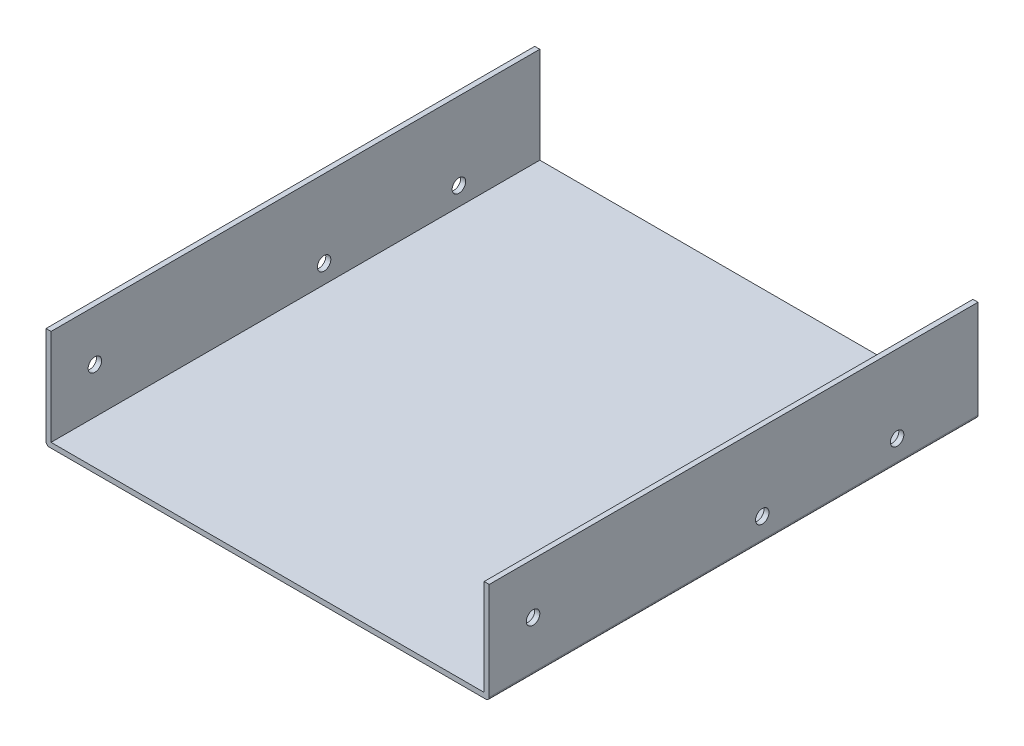
ISO-10303-21;
HEADER;
FILE_DESCRIPTION(('STEP AP214'),'2;1');
FILE_NAME('part.step','',(''),(''),'','','');
FILE_SCHEMA(('AUTOMOTIVE_DESIGN { 1 0 10303 214 1 1 1 1 }'));
ENDSEC;
DATA;
#1=APPLICATION_CONTEXT('core data for automotive mechanical design processes');
#2=APPLICATION_PROTOCOL_DEFINITION('international standard','automotive_design',2000,#1);
#3=PRODUCT_CONTEXT('',#1,'mechanical');
#4=PRODUCT('Part','Part','',(#3));
#5=PRODUCT_RELATED_PRODUCT_CATEGORY('part','',(#4));
#6=PRODUCT_DEFINITION_FORMATION('','',#4);
#7=PRODUCT_DEFINITION_CONTEXT('part definition',#1,'design');
#8=PRODUCT_DEFINITION('design','',#6,#7);
#9=PRODUCT_DEFINITION_SHAPE('','',#8);
#10=(LENGTH_UNIT() NAMED_UNIT(*) SI_UNIT(.MILLI.,.METRE.));
#11=(NAMED_UNIT(*) PLANE_ANGLE_UNIT() SI_UNIT($,.RADIAN.));
#12=(NAMED_UNIT(*) SI_UNIT($,.STERADIAN.) SOLID_ANGLE_UNIT());
#13=UNCERTAINTY_MEASURE_WITH_UNIT(LENGTH_MEASURE(1.E-05),#10,'distance_accuracy_value','');
#14=(GEOMETRIC_REPRESENTATION_CONTEXT(3) GLOBAL_UNCERTAINTY_ASSIGNED_CONTEXT((#13)) GLOBAL_UNIT_ASSIGNED_CONTEXT((#10,
#11,#12)) REPRESENTATION_CONTEXT('',''));
#15=CARTESIAN_POINT('',(0.,0.,0.));
#16=DIRECTION('',(0.,0.,1.));
#17=DIRECTION('',(1.,0.,0.));
#18=AXIS2_PLACEMENT_3D('',#15,#16,#17);
#19=CARTESIAN_POINT('',(-65.75,14.5,72.5));
#20=DIRECTION('',(1.,0.,0.));
#21=DIRECTION('',(0.,1.,0.));
#22=AXIS2_PLACEMENT_3D('',#19,#20,#21);
#23=PLANE('',#22);
#24=CARTESIAN_POINT('',(-65.75,-8.49999999999997,-48.5));
#25=DIRECTION('',(1.,0.,0.));
#26=DIRECTION('',(0.,1.,0.));
#27=AXIS2_PLACEMENT_3D('',#24,#25,#26);
#28=CIRCLE('',#27,2.);
#29=CARTESIAN_POINT('',(-65.75,-6.49999999999997,-48.5));
#30=VERTEX_POINT('',#29);
#31=EDGE_CURVE('E194',#30,#30,#28,.T.);
#32=ORIENTED_EDGE('',*,*,#31,.T.);
#33=EDGE_LOOP('',(#32));
#34=FACE_BOUND('',#33,.T.);
#35=CARTESIAN_POINT('',(-65.75,-8.49999999999997,-8.49999999999999));
#36=DIRECTION('',(1.,0.,0.));
#37=DIRECTION('',(0.,1.,0.));
#38=AXIS2_PLACEMENT_3D('',#35,#36,#37);
#39=CIRCLE('',#38,2.);
#40=CARTESIAN_POINT('',(-65.75,-6.49999999999997,-8.49999999999999));
#41=VERTEX_POINT('',#40);
#42=EDGE_CURVE('E191',#41,#41,#39,.T.);
#43=ORIENTED_EDGE('',*,*,#42,.T.);
#44=EDGE_LOOP('',(#43));
#45=FACE_BOUND('',#44,.T.);
#46=CARTESIAN_POINT('',(-65.75,-0.499999999999969,59.5));
#47=DIRECTION('',(1.,0.,0.));
#48=DIRECTION('',(0.,1.,0.));
#49=AXIS2_PLACEMENT_3D('',#46,#47,#48);
#50=CIRCLE('',#49,2.);
#51=CARTESIAN_POINT('',(-65.75,1.50000000000003,59.5));
#52=VERTEX_POINT('',#51);
#53=EDGE_CURVE('E147',#52,#52,#50,.T.);
#54=ORIENTED_EDGE('',*,*,#53,.T.);
#55=EDGE_LOOP('',(#54));
#56=FACE_BOUND('',#55,.T.);
#57=DIRECTION('',(0.,-1.,0.));
#58=VECTOR('',#57,1.);
#59=CARTESIAN_POINT('',(-65.75,14.5,-72.5));
#60=LINE('',#59,#58);
#61=CARTESIAN_POINT('',(-65.75,14.5,-72.5));
#62=VERTEX_POINT('',#61);
#63=CARTESIAN_POINT('',(-65.75,-14.5,-72.5));
#64=VERTEX_POINT('',#63);
#65=EDGE_CURVE('E143',#62,#64,#60,.T.);
#66=ORIENTED_EDGE('',*,*,#65,.T.);
#67=DIRECTION('',(0.,0.,-1.));
#68=VECTOR('',#67,1.);
#69=CARTESIAN_POINT('',(-65.75,-14.5,72.5));
#70=LINE('',#69,#68);
#71=CARTESIAN_POINT('',(-65.75,-14.5,72.5));
#72=VERTEX_POINT('',#71);
#73=EDGE_CURVE('E11',#72,#64,#70,.T.);
#74=ORIENTED_EDGE('',*,*,#73,.F.);
#75=DIRECTION('',(0.,-1.,0.));
#76=VECTOR('',#75,1.);
#77=CARTESIAN_POINT('',(-65.75,14.5,72.5));
#78=LINE('',#77,#76);
#79=CARTESIAN_POINT('',(-65.75,14.5,72.5));
#80=VERTEX_POINT('',#79);
#81=EDGE_CURVE('E162',#80,#72,#78,.T.);
#82=ORIENTED_EDGE('',*,*,#81,.F.);
#83=DIRECTION('',(0.,0.,-1.));
#84=VECTOR('',#83,1.);
#85=CARTESIAN_POINT('',(-65.75,14.5,72.5));
#86=LINE('',#85,#84);
#87=EDGE_CURVE('E139',#80,#62,#86,.T.);
#88=ORIENTED_EDGE('',*,*,#87,.T.);
#89=EDGE_LOOP('',(#66,#74,#82,#88));
#90=FACE_BOUND('',#89,.T.);
#91=ADVANCED_FACE('F33',(#34,#45,#56,#90),#23,.F.);
#92=CARTESIAN_POINT('',(-64.75,-14.5,72.5));
#93=DIRECTION('',(0.,0.,-1.));
#94=DIRECTION('',(-1.,0.,0.));
#95=AXIS2_PLACEMENT_3D('',#92,#93,#94);
#96=CYLINDRICAL_SURFACE('',#95,1.);
#97=CARTESIAN_POINT('',(-64.75,-14.5,-72.5));
#98=DIRECTION('',(0.,0.,1.));
#99=DIRECTION('',(1.,0.,0.));
#100=AXIS2_PLACEMENT_3D('',#97,#98,#99);
#101=CIRCLE('',#100,1.);
#102=CARTESIAN_POINT('',(-64.75,-15.5,-72.5));
#103=VERTEX_POINT('',#102);
#104=EDGE_CURVE('E146',#64,#103,#101,.T.);
#105=ORIENTED_EDGE('',*,*,#104,.T.);
#106=DIRECTION('',(0.,0.,-1.));
#107=VECTOR('',#106,1.);
#108=CARTESIAN_POINT('',(-64.75,-15.5,72.5));
#109=LINE('',#108,#107);
#110=CARTESIAN_POINT('',(-64.75,-15.5,72.5));
#111=VERTEX_POINT('',#110);
#112=EDGE_CURVE('E42',#111,#103,#109,.T.);
#113=ORIENTED_EDGE('',*,*,#112,.F.);
#114=CARTESIAN_POINT('',(-64.75,-14.5,72.5));
#115=DIRECTION('',(0.,0.,1.));
#116=DIRECTION('',(1.,0.,0.));
#117=AXIS2_PLACEMENT_3D('',#114,#115,#116);
#118=CIRCLE('',#117,1.);
#119=EDGE_CURVE('E100',#72,#111,#118,.T.);
#120=ORIENTED_EDGE('',*,*,#119,.F.);
#121=ORIENTED_EDGE('',*,*,#73,.T.);
#122=EDGE_LOOP('',(#105,#113,#120,#121));
#123=FACE_BOUND('',#122,.T.);
#124=ADVANCED_FACE('F249',(#123),#96,.T.);
#125=CARTESIAN_POINT('',(-64.75,-15.5,72.5));
#126=DIRECTION('',(0.,1.,0.));
#127=DIRECTION('',(-1.,0.,0.));
#128=AXIS2_PLACEMENT_3D('',#125,#126,#127);
#129=PLANE('',#128);
#130=DIRECTION('',(1.,0.,0.));
#131=VECTOR('',#130,1.);
#132=CARTESIAN_POINT('',(-64.75,-15.5,-72.5));
#133=LINE('',#132,#131);
#134=CARTESIAN_POINT('',(64.75,-15.5,-72.5));
#135=VERTEX_POINT('',#134);
#136=EDGE_CURVE('E149',#103,#135,#133,.T.);
#137=ORIENTED_EDGE('',*,*,#136,.T.);
#138=DIRECTION('',(0.,0.,-1.));
#139=VECTOR('',#138,1.);
#140=CARTESIAN_POINT('',(64.75,-15.5,72.5));
#141=LINE('',#140,#139);
#142=CARTESIAN_POINT('',(64.75,-15.5,72.5));
#143=VERTEX_POINT('',#142);
#144=EDGE_CURVE('E175',#143,#135,#141,.T.);
#145=ORIENTED_EDGE('',*,*,#144,.F.);
#146=DIRECTION('',(1.,0.,0.));
#147=VECTOR('',#146,1.);
#148=CARTESIAN_POINT('',(-64.75,-15.5,72.5));
#149=LINE('',#148,#147);
#150=EDGE_CURVE('E213',#111,#143,#149,.T.);
#151=ORIENTED_EDGE('',*,*,#150,.F.);
#152=ORIENTED_EDGE('',*,*,#112,.T.);
#153=EDGE_LOOP('',(#137,#145,#151,#152));
#154=FACE_BOUND('',#153,.T.);
#155=ADVANCED_FACE('F254',(#154),#129,.F.);
#156=CARTESIAN_POINT('',(64.75,-14.5,72.5));
#157=DIRECTION('',(0.,0.,-1.));
#158=DIRECTION('',(-1.,0.,0.));
#159=AXIS2_PLACEMENT_3D('',#156,#157,#158);
#160=CYLINDRICAL_SURFACE('',#159,1.00000000000003);
#161=CARTESIAN_POINT('',(64.75,-14.5,-72.5));
#162=DIRECTION('',(0.,0.,1.));
#163=DIRECTION('',(1.,0.,0.));
#164=AXIS2_PLACEMENT_3D('',#161,#162,#163);
#165=CIRCLE('',#164,1.00000000000003);
#166=CARTESIAN_POINT('',(65.75,-14.5,-72.5));
#167=VERTEX_POINT('',#166);
#168=EDGE_CURVE('E151',#135,#167,#165,.T.);
#169=ORIENTED_EDGE('',*,*,#168,.T.);
#170=DIRECTION('',(0.,0.,-1.));
#171=VECTOR('',#170,1.);
#172=CARTESIAN_POINT('',(65.75,-14.5,72.5));
#173=LINE('',#172,#171);
#174=CARTESIAN_POINT('',(65.75,-14.5,72.5));
#175=VERTEX_POINT('',#174);
#176=EDGE_CURVE('E172',#175,#167,#173,.T.);
#177=ORIENTED_EDGE('',*,*,#176,.F.);
#178=CARTESIAN_POINT('',(64.75,-14.5,72.5));
#179=DIRECTION('',(0.,0.,1.));
#180=DIRECTION('',(1.,0.,0.));
#181=AXIS2_PLACEMENT_3D('',#178,#179,#180);
#182=CIRCLE('',#181,1.00000000000003);
#183=EDGE_CURVE('E215',#143,#175,#182,.T.);
#184=ORIENTED_EDGE('',*,*,#183,.F.);
#185=ORIENTED_EDGE('',*,*,#144,.T.);
#186=EDGE_LOOP('',(#169,#177,#184,#185));
#187=FACE_BOUND('',#186,.T.);
#188=ADVANCED_FACE('F300',(#187),#160,.T.);
#189=CARTESIAN_POINT('',(65.75,14.5,72.5));
#190=DIRECTION('',(-1.,0.,0.));
#191=DIRECTION('',(0.,-1.,0.));
#192=AXIS2_PLACEMENT_3D('',#189,#190,#191);
#193=PLANE('',#192);
#194=CARTESIAN_POINT('',(65.75,-8.49999999999997,-48.5));
#195=DIRECTION('',(1.,0.,0.));
#196=DIRECTION('',(0.,0.,-1.));
#197=AXIS2_PLACEMENT_3D('',#194,#195,#196);
#198=CIRCLE('',#197,2.);
#199=CARTESIAN_POINT('',(65.75,-8.49999999999997,-50.5));
#200=VERTEX_POINT('',#199);
#201=EDGE_CURVE('E290',#200,#200,#198,.T.);
#202=ORIENTED_EDGE('',*,*,#201,.F.);
#203=EDGE_LOOP('',(#202));
#204=FACE_BOUND('',#203,.T.);
#205=CARTESIAN_POINT('',(65.75,-8.49999999999997,-8.49999999999999));
#206=DIRECTION('',(1.,0.,0.));
#207=DIRECTION('',(0.,0.,-1.));
#208=AXIS2_PLACEMENT_3D('',#205,#206,#207);
#209=CIRCLE('',#208,2.);
#210=CARTESIAN_POINT('',(65.75,-8.49999999999997,-10.5));
#211=VERTEX_POINT('',#210);
#212=EDGE_CURVE('E187',#211,#211,#209,.T.);
#213=ORIENTED_EDGE('',*,*,#212,.F.);
#214=EDGE_LOOP('',(#213));
#215=FACE_BOUND('',#214,.T.);
#216=CARTESIAN_POINT('',(65.75,-0.499999999999969,59.5));
#217=DIRECTION('',(1.,0.,0.));
#218=DIRECTION('',(0.,0.,-1.));
#219=AXIS2_PLACEMENT_3D('',#216,#217,#218);
#220=CIRCLE('',#219,2.);
#221=CARTESIAN_POINT('',(65.75,-0.499999999999969,57.5));
#222=VERTEX_POINT('',#221);
#223=EDGE_CURVE('E183',#222,#222,#220,.T.);
#224=ORIENTED_EDGE('',*,*,#223,.F.);
#225=EDGE_LOOP('',(#224));
#226=FACE_BOUND('',#225,.T.);
#227=DIRECTION('',(0.,1.,0.));
#228=VECTOR('',#227,1.);
#229=CARTESIAN_POINT('',(65.75,14.5,-72.5));
#230=LINE('',#229,#228);
#231=CARTESIAN_POINT('',(65.75,14.5,-72.5));
#232=VERTEX_POINT('',#231);
#233=EDGE_CURVE('E153',#167,#232,#230,.T.);
#234=ORIENTED_EDGE('',*,*,#233,.T.);
#235=DIRECTION('',(0.,0.,-1.));
#236=VECTOR('',#235,1.);
#237=CARTESIAN_POINT('',(65.75,14.5,72.5));
#238=LINE('',#237,#236);
#239=CARTESIAN_POINT('',(65.75,14.5,72.5));
#240=VERTEX_POINT('',#239);
#241=EDGE_CURVE('E169',#240,#232,#238,.T.);
#242=ORIENTED_EDGE('',*,*,#241,.F.);
#243=DIRECTION('',(0.,1.,0.));
#244=VECTOR('',#243,1.);
#245=CARTESIAN_POINT('',(65.75,14.5,72.5));
#246=LINE('',#245,#244);
#247=EDGE_CURVE('E217',#175,#240,#246,.T.);
#248=ORIENTED_EDGE('',*,*,#247,.F.);
#249=ORIENTED_EDGE('',*,*,#176,.T.);
#250=EDGE_LOOP('',(#234,#242,#248,#249));
#251=FACE_BOUND('',#250,.T.);
#252=ADVANCED_FACE('F297',(#204,#215,#226,#251),#193,.F.);
#253=CARTESIAN_POINT('',(64.25,14.5,72.5));
#254=DIRECTION('',(0.,-1.,0.));
#255=DIRECTION('',(0.,0.,-1.));
#256=AXIS2_PLACEMENT_3D('',#253,#254,#255);
#257=PLANE('',#256);
#258=DIRECTION('',(-1.,0.,0.));
#259=VECTOR('',#258,1.);
#260=CARTESIAN_POINT('',(64.25,14.5,-72.5));
#261=LINE('',#260,#259);
#262=CARTESIAN_POINT('',(64.25,14.5,-72.5));
#263=VERTEX_POINT('',#262);
#264=EDGE_CURVE('E155',#232,#263,#261,.T.);
#265=ORIENTED_EDGE('',*,*,#264,.T.);
#266=DIRECTION('',(0.,0.,-1.));
#267=VECTOR('',#266,1.);
#268=CARTESIAN_POINT('',(64.25,14.5,72.5));
#269=LINE('',#268,#267);
#270=CARTESIAN_POINT('',(64.25,14.5,72.5));
#271=VERTEX_POINT('',#270);
#272=EDGE_CURVE('E166',#271,#263,#269,.T.);
#273=ORIENTED_EDGE('',*,*,#272,.F.);
#274=DIRECTION('',(-1.,0.,0.));
#275=VECTOR('',#274,1.);
#276=CARTESIAN_POINT('',(64.25,14.5,72.5));
#277=LINE('',#276,#275);
#278=EDGE_CURVE('E219',#240,#271,#277,.T.);
#279=ORIENTED_EDGE('',*,*,#278,.F.);
#280=ORIENTED_EDGE('',*,*,#241,.T.);
#281=EDGE_LOOP('',(#265,#273,#279,#280));
#282=FACE_BOUND('',#281,.T.);
#283=ADVANCED_FACE('F225',(#282),#257,.F.);
#284=CARTESIAN_POINT('',(64.25,-14.,72.5));
#285=DIRECTION('',(1.,0.,0.));
#286=DIRECTION('',(0.,1.,0.));
#287=AXIS2_PLACEMENT_3D('',#284,#285,#286);
#288=PLANE('',#287);
#289=CARTESIAN_POINT('',(64.25,-8.49999999999997,-48.5));
#290=DIRECTION('',(1.,0.,0.));
#291=DIRECTION('',(0.,1.,0.));
#292=AXIS2_PLACEMENT_3D('',#289,#290,#291);
#293=CIRCLE('',#292,2.);
#294=CARTESIAN_POINT('',(64.25,-6.49999999999997,-48.5));
#295=VERTEX_POINT('',#294);
#296=EDGE_CURVE('E199',#295,#295,#293,.T.);
#297=ORIENTED_EDGE('',*,*,#296,.T.);
#298=EDGE_LOOP('',(#297));
#299=FACE_BOUND('',#298,.T.);
#300=CARTESIAN_POINT('',(64.25,-8.49999999999997,-8.49999999999999));
#301=DIRECTION('',(1.,0.,0.));
#302=DIRECTION('',(0.,1.,0.));
#303=AXIS2_PLACEMENT_3D('',#300,#301,#302);
#304=CIRCLE('',#303,2.);
#305=CARTESIAN_POINT('',(64.25,-6.49999999999997,-8.49999999999999));
#306=VERTEX_POINT('',#305);
#307=EDGE_CURVE('E186',#306,#306,#304,.T.);
#308=ORIENTED_EDGE('',*,*,#307,.T.);
#309=EDGE_LOOP('',(#308));
#310=FACE_BOUND('',#309,.T.);
#311=CARTESIAN_POINT('',(64.25,-0.499999999999969,59.5));
#312=DIRECTION('',(1.,0.,0.));
#313=DIRECTION('',(0.,1.,0.));
#314=AXIS2_PLACEMENT_3D('',#311,#312,#313);
#315=CIRCLE('',#314,2.);
#316=CARTESIAN_POINT('',(64.25,1.50000000000003,59.5));
#317=VERTEX_POINT('',#316);
#318=EDGE_CURVE('E182',#317,#317,#315,.T.);
#319=ORIENTED_EDGE('',*,*,#318,.T.);
#320=EDGE_LOOP('',(#319));
#321=FACE_BOUND('',#320,.T.);
#322=DIRECTION('',(0.,-1.,0.));
#323=VECTOR('',#322,1.);
#324=CARTESIAN_POINT('',(64.25,-14.,-72.5));
#325=LINE('',#324,#323);
#326=CARTESIAN_POINT('',(64.25,-14.,-72.5));
#327=VERTEX_POINT('',#326);
#328=EDGE_CURVE('E157',#263,#327,#325,.T.);
#329=ORIENTED_EDGE('',*,*,#328,.T.);
#330=DIRECTION('',(0.,0.,-1.));
#331=VECTOR('',#330,1.);
#332=CARTESIAN_POINT('',(64.25,-14.,72.5));
#333=LINE('',#332,#331);
#334=CARTESIAN_POINT('',(64.25,-14.,72.5));
#335=VERTEX_POINT('',#334);
#336=EDGE_CURVE('E134',#335,#327,#333,.T.);
#337=ORIENTED_EDGE('',*,*,#336,.F.);
#338=DIRECTION('',(0.,-1.,0.));
#339=VECTOR('',#338,1.);
#340=CARTESIAN_POINT('',(64.25,-14.,72.5));
#341=LINE('',#340,#339);
#342=EDGE_CURVE('E125',#271,#335,#341,.T.);
#343=ORIENTED_EDGE('',*,*,#342,.F.);
#344=ORIENTED_EDGE('',*,*,#272,.T.);
#345=EDGE_LOOP('',(#329,#337,#343,#344));
#346=FACE_BOUND('',#345,.T.);
#347=ADVANCED_FACE('F229',(#299,#310,#321,#346),#288,.F.);
#348=CARTESIAN_POINT('',(-64.25,-14.,72.5));
#349=DIRECTION('',(0.,-1.,0.));
#350=DIRECTION('',(1.,0.,0.));
#351=AXIS2_PLACEMENT_3D('',#348,#349,#350);
#352=PLANE('',#351);
#353=DIRECTION('',(-1.,0.,0.));
#354=VECTOR('',#353,1.);
#355=CARTESIAN_POINT('',(-64.25,-14.,-72.5));
#356=LINE('',#355,#354);
#357=CARTESIAN_POINT('',(-64.25,-14.,-72.5));
#358=VERTEX_POINT('',#357);
#359=EDGE_CURVE('E133',#327,#358,#356,.T.);
#360=ORIENTED_EDGE('',*,*,#359,.T.);
#361=DIRECTION('',(0.,0.,-1.));
#362=VECTOR('',#361,1.);
#363=CARTESIAN_POINT('',(-64.25,-14.,72.5));
#364=LINE('',#363,#362);
#365=CARTESIAN_POINT('',(-64.25,-14.,72.5));
#366=VERTEX_POINT('',#365);
#367=EDGE_CURVE('E130',#366,#358,#364,.T.);
#368=ORIENTED_EDGE('',*,*,#367,.F.);
#369=DIRECTION('',(-1.,0.,0.));
#370=VECTOR('',#369,1.);
#371=CARTESIAN_POINT('',(-64.25,-14.,72.5));
#372=LINE('',#371,#370);
#373=EDGE_CURVE('E119',#335,#366,#372,.T.);
#374=ORIENTED_EDGE('',*,*,#373,.F.);
#375=ORIENTED_EDGE('',*,*,#336,.T.);
#376=EDGE_LOOP('',(#360,#368,#374,#375));
#377=FACE_BOUND('',#376,.T.);
#378=ADVANCED_FACE('F131',(#377),#352,.F.);
#379=CARTESIAN_POINT('',(-64.25,14.5,72.5));
#380=DIRECTION('',(-1.,0.,0.));
#381=DIRECTION('',(0.,0.,1.));
#382=AXIS2_PLACEMENT_3D('',#379,#380,#381);
#383=PLANE('',#382);
#384=CARTESIAN_POINT('',(-64.25,-8.49999999999997,-48.5));
#385=DIRECTION('',(-1.,0.,0.));
#386=DIRECTION('',(0.,0.,1.));
#387=AXIS2_PLACEMENT_3D('',#384,#385,#386);
#388=CIRCLE('',#387,2.);
#389=CARTESIAN_POINT('',(-64.25,-8.49999999999997,-46.5));
#390=VERTEX_POINT('',#389);
#391=EDGE_CURVE('E36',#390,#390,#388,.T.);
#392=ORIENTED_EDGE('',*,*,#391,.T.);
#393=EDGE_LOOP('',(#392));
#394=FACE_BOUND('',#393,.T.);
#395=CARTESIAN_POINT('',(-64.25,-8.49999999999997,-8.49999999999999));
#396=DIRECTION('',(-1.,0.,0.));
#397=DIRECTION('',(0.,0.,1.));
#398=AXIS2_PLACEMENT_3D('',#395,#396,#397);
#399=CIRCLE('',#398,2.);
#400=CARTESIAN_POINT('',(-64.25,-8.49999999999997,-6.49999999999999));
#401=VERTEX_POINT('',#400);
#402=EDGE_CURVE('E184',#401,#401,#399,.T.);
#403=ORIENTED_EDGE('',*,*,#402,.T.);
#404=EDGE_LOOP('',(#403));
#405=FACE_BOUND('',#404,.T.);
#406=CARTESIAN_POINT('',(-64.25,-0.499999999999969,59.5));
#407=DIRECTION('',(-1.,0.,0.));
#408=DIRECTION('',(0.,0.,1.));
#409=AXIS2_PLACEMENT_3D('',#406,#407,#408);
#410=CIRCLE('',#409,2.);
#411=CARTESIAN_POINT('',(-64.25,-0.499999999999969,61.5));
#412=VERTEX_POINT('',#411);
#413=EDGE_CURVE('E180',#412,#412,#410,.T.);
#414=ORIENTED_EDGE('',*,*,#413,.T.);
#415=EDGE_LOOP('',(#414));
#416=FACE_BOUND('',#415,.T.);
#417=DIRECTION('',(0.,1.,0.));
#418=VECTOR('',#417,1.);
#419=CARTESIAN_POINT('',(-64.25,14.5,-72.5));
#420=LINE('',#419,#418);
#421=CARTESIAN_POINT('',(-64.25,14.5,-72.5));
#422=VERTEX_POINT('',#421);
#423=EDGE_CURVE('E86',#358,#422,#420,.T.);
#424=ORIENTED_EDGE('',*,*,#423,.T.);
#425=DIRECTION('',(0.,0.,-1.));
#426=VECTOR('',#425,1.);
#427=CARTESIAN_POINT('',(-64.25,14.5,72.5));
#428=LINE('',#427,#426);
#429=CARTESIAN_POINT('',(-64.25,14.5,72.5));
#430=VERTEX_POINT('',#429);
#431=EDGE_CURVE('E135',#430,#422,#428,.T.);
#432=ORIENTED_EDGE('',*,*,#431,.F.);
#433=DIRECTION('',(0.,1.,0.));
#434=VECTOR('',#433,1.);
#435=CARTESIAN_POINT('',(-64.25,14.5,72.5));
#436=LINE('',#435,#434);
#437=EDGE_CURVE('E123',#366,#430,#436,.T.);
#438=ORIENTED_EDGE('',*,*,#437,.F.);
#439=ORIENTED_EDGE('',*,*,#367,.T.);
#440=EDGE_LOOP('',(#424,#432,#438,#439));
#441=FACE_BOUND('',#440,.T.);
#442=ADVANCED_FACE('F137',(#394,#405,#416,#441),#383,.F.);
#443=CARTESIAN_POINT('',(-65.75,14.5,72.5));
#444=DIRECTION('',(0.,-1.,0.));
#445=DIRECTION('',(0.,0.,-1.));
#446=AXIS2_PLACEMENT_3D('',#443,#444,#445);
#447=PLANE('',#446);
#448=DIRECTION('',(-1.,0.,0.));
#449=VECTOR('',#448,1.);
#450=CARTESIAN_POINT('',(-65.75,14.5,-72.5));
#451=LINE('',#450,#449);
#452=EDGE_CURVE('E92',#422,#62,#451,.T.);
#453=ORIENTED_EDGE('',*,*,#452,.T.);
#454=ORIENTED_EDGE('',*,*,#87,.F.);
#455=DIRECTION('',(-1.,0.,0.));
#456=VECTOR('',#455,1.);
#457=CARTESIAN_POINT('',(-65.75,14.5,72.5));
#458=LINE('',#457,#456);
#459=EDGE_CURVE('E51',#430,#80,#458,.T.);
#460=ORIENTED_EDGE('',*,*,#459,.F.);
#461=ORIENTED_EDGE('',*,*,#431,.T.);
#462=EDGE_LOOP('',(#453,#454,#460,#461));
#463=FACE_BOUND('',#462,.T.);
#464=ADVANCED_FACE('F237',(#463),#447,.F.);
#465=CARTESIAN_POINT('',(-64.75,-14.5,72.5));
#466=DIRECTION('',(0.,0.,1.));
#467=DIRECTION('',(1.,0.,0.));
#468=AXIS2_PLACEMENT_3D('',#465,#466,#467);
#469=PLANE('',#468);
#470=ORIENTED_EDGE('',*,*,#81,.T.);
#471=ORIENTED_EDGE('',*,*,#119,.T.);
#472=ORIENTED_EDGE('',*,*,#150,.T.);
#473=ORIENTED_EDGE('',*,*,#183,.T.);
#474=ORIENTED_EDGE('',*,*,#247,.T.);
#475=ORIENTED_EDGE('',*,*,#278,.T.);
#476=ORIENTED_EDGE('',*,*,#342,.T.);
#477=ORIENTED_EDGE('',*,*,#373,.T.);
#478=ORIENTED_EDGE('',*,*,#437,.T.);
#479=ORIENTED_EDGE('',*,*,#459,.T.);
#480=EDGE_LOOP('',(#470,#471,#472,#473,#474,#475,#476,#477,#478,#479));
#481=FACE_BOUND('',#480,.T.);
#482=ADVANCED_FACE('F121',(#481),#469,.T.);
#483=CARTESIAN_POINT('',(-64.75,-14.5,-72.5));
#484=DIRECTION('',(0.,0.,1.));
#485=DIRECTION('',(1.,0.,0.));
#486=AXIS2_PLACEMENT_3D('',#483,#484,#485);
#487=PLANE('',#486);
#488=ORIENTED_EDGE('',*,*,#65,.F.);
#489=ORIENTED_EDGE('',*,*,#452,.F.);
#490=ORIENTED_EDGE('',*,*,#423,.F.);
#491=ORIENTED_EDGE('',*,*,#359,.F.);
#492=ORIENTED_EDGE('',*,*,#328,.F.);
#493=ORIENTED_EDGE('',*,*,#264,.F.);
#494=ORIENTED_EDGE('',*,*,#233,.F.);
#495=ORIENTED_EDGE('',*,*,#168,.F.);
#496=ORIENTED_EDGE('',*,*,#136,.F.);
#497=ORIENTED_EDGE('',*,*,#104,.F.);
#498=EDGE_LOOP('',(#488,#489,#490,#491,#492,#493,#494,#495,#496,#497));
#499=FACE_BOUND('',#498,.T.);
#500=ADVANCED_FACE('F232',(#499),#487,.F.);
#501=CARTESIAN_POINT('',(-79.25,-0.499999999999969,59.5));
#502=DIRECTION('',(1.,0.,0.));
#503=DIRECTION('',(0.,0.,-1.));
#504=AXIS2_PLACEMENT_3D('',#501,#502,#503);
#505=CYLINDRICAL_SURFACE('',#504,2.);
#506=ORIENTED_EDGE('',*,*,#413,.F.);
#507=EDGE_LOOP('',(#506));
#508=FACE_BOUND('',#507,.T.);
#509=ORIENTED_EDGE('',*,*,#53,.F.);
#510=EDGE_LOOP('',(#509));
#511=FACE_BOUND('',#510,.T.);
#512=ADVANCED_FACE('F261',(#508,#511),#505,.F.);
#513=ORIENTED_EDGE('',*,*,#223,.T.);
#514=EDGE_LOOP('',(#513));
#515=FACE_BOUND('',#514,.T.);
#516=ORIENTED_EDGE('',*,*,#318,.F.);
#517=EDGE_LOOP('',(#516));
#518=FACE_BOUND('',#517,.T.);
#519=ADVANCED_FACE('F263',(#515,#518),#505,.F.);
#520=CARTESIAN_POINT('',(-79.25,-8.49999999999997,-8.49999999999999));
#521=DIRECTION('',(1.,0.,0.));
#522=DIRECTION('',(0.,0.,-1.));
#523=AXIS2_PLACEMENT_3D('',#520,#521,#522);
#524=CYLINDRICAL_SURFACE('',#523,2.);
#525=ORIENTED_EDGE('',*,*,#402,.F.);
#526=EDGE_LOOP('',(#525));
#527=FACE_BOUND('',#526,.T.);
#528=ORIENTED_EDGE('',*,*,#42,.F.);
#529=EDGE_LOOP('',(#528));
#530=FACE_BOUND('',#529,.T.);
#531=ADVANCED_FACE('F270',(#527,#530),#524,.F.);
#532=ORIENTED_EDGE('',*,*,#212,.T.);
#533=EDGE_LOOP('',(#532));
#534=FACE_BOUND('',#533,.T.);
#535=ORIENTED_EDGE('',*,*,#307,.F.);
#536=EDGE_LOOP('',(#535));
#537=FACE_BOUND('',#536,.T.);
#538=ADVANCED_FACE('F276',(#534,#537),#524,.F.);
#539=CARTESIAN_POINT('',(-79.25,-8.49999999999997,-48.5));
#540=DIRECTION('',(1.,0.,0.));
#541=DIRECTION('',(0.,0.,-1.));
#542=AXIS2_PLACEMENT_3D('',#539,#540,#541);
#543=CYLINDRICAL_SURFACE('',#542,2.);
#544=ORIENTED_EDGE('',*,*,#391,.F.);
#545=EDGE_LOOP('',(#544));
#546=FACE_BOUND('',#545,.T.);
#547=ORIENTED_EDGE('',*,*,#31,.F.);
#548=EDGE_LOOP('',(#547));
#549=FACE_BOUND('',#548,.T.);
#550=ADVANCED_FACE('F278',(#546,#549),#543,.F.);
#551=ORIENTED_EDGE('',*,*,#201,.T.);
#552=EDGE_LOOP('',(#551));
#553=FACE_BOUND('',#552,.T.);
#554=ORIENTED_EDGE('',*,*,#296,.F.);
#555=EDGE_LOOP('',(#554));
#556=FACE_BOUND('',#555,.T.);
#557=ADVANCED_FACE('F280',(#553,#556),#543,.F.);
#558=CLOSED_SHELL('',(#91,#124,#155,#188,#252,#283,#347,#378,#442,#464,#482,#500,#512,#519,#531,
#538,#550,#557));
#559=MANIFOLD_SOLID_BREP('B2',#558);
#560=ADVANCED_BREP_SHAPE_REPRESENTATION('',(#18,#559),#14);
#561=SHAPE_DEFINITION_REPRESENTATION(#9,#560);
ENDSEC;
END-ISO-10303-21;
